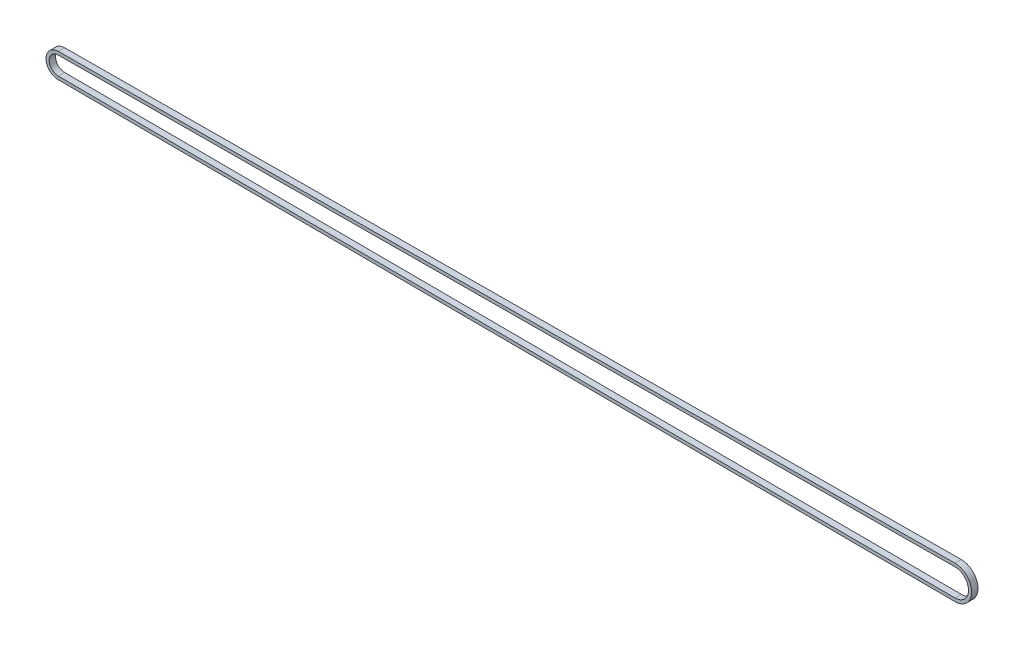
ISO-10303-21;
HEADER;
FILE_DESCRIPTION(('STEP AP214'),'2;1');
FILE_NAME('part.step','',(''),(''),'','','');
FILE_SCHEMA(('AUTOMOTIVE_DESIGN { 1 0 10303 214 1 1 1 1 }'));
ENDSEC;
DATA;
#1=APPLICATION_CONTEXT('core data for automotive mechanical design processes');
#2=APPLICATION_PROTOCOL_DEFINITION('international standard','automotive_design',2000,#1);
#3=PRODUCT_CONTEXT('',#1,'mechanical');
#4=PRODUCT('Part','Part','',(#3));
#5=PRODUCT_RELATED_PRODUCT_CATEGORY('part','',(#4));
#6=PRODUCT_DEFINITION_FORMATION('','',#4);
#7=PRODUCT_DEFINITION_CONTEXT('part definition',#1,'design');
#8=PRODUCT_DEFINITION('design','',#6,#7);
#9=PRODUCT_DEFINITION_SHAPE('','',#8);
#10=(LENGTH_UNIT() NAMED_UNIT(*) SI_UNIT(.MILLI.,.METRE.));
#11=(NAMED_UNIT(*) PLANE_ANGLE_UNIT() SI_UNIT($,.RADIAN.));
#12=(NAMED_UNIT(*) SI_UNIT($,.STERADIAN.) SOLID_ANGLE_UNIT());
#13=UNCERTAINTY_MEASURE_WITH_UNIT(LENGTH_MEASURE(1.E-05),#10,'distance_accuracy_value','');
#14=(GEOMETRIC_REPRESENTATION_CONTEXT(3) GLOBAL_UNCERTAINTY_ASSIGNED_CONTEXT((#13)) GLOBAL_UNIT_ASSIGNED_CONTEXT((#10,
#11,#12)) REPRESENTATION_CONTEXT('',''));
#15=CARTESIAN_POINT('',(0.,0.,0.));
#16=DIRECTION('',(0.,0.,1.));
#17=DIRECTION('',(1.,0.,0.));
#18=AXIS2_PLACEMENT_3D('',#15,#16,#17);
#19=CARTESIAN_POINT('',(-550.781947160668,-62.6493798332166,4.));
#20=DIRECTION('',(0.,0.,-1.));
#21=DIRECTION('',(-1.,0.,0.));
#22=AXIS2_PLACEMENT_3D('',#19,#20,#21);
#23=CYLINDRICAL_SURFACE('',#22,7.75);
#24=CARTESIAN_POINT('',(-550.781947160668,-62.6493798332166,0.));
#25=DIRECTION('',(0.,0.,-1.));
#26=DIRECTION('',(-1.,0.,0.));
#27=AXIS2_PLACEMENT_3D('',#24,#25,#26);
#28=CIRCLE('',#27,7.75);
#29=CARTESIAN_POINT('',(-550.813007049679,-70.3993175931792,0.));
#30=VERTEX_POINT('',#29);
#31=CARTESIAN_POINT('',(-550.826210376147,-54.8995062363277,0.));
#32=VERTEX_POINT('',#31);
#33=EDGE_CURVE('E157',#30,#32,#28,.T.);
#34=ORIENTED_EDGE('',*,*,#33,.F.);
#35=DIRECTION('',(0.,0.,-1.));
#36=VECTOR('',#35,1.);
#37=CARTESIAN_POINT('',(-550.813007049679,-70.3993175931792,4.));
#38=LINE('',#37,#36);
#39=CARTESIAN_POINT('',(-550.813007049679,-70.3993175931792,4.));
#40=VERTEX_POINT('',#39);
#41=EDGE_CURVE('E12',#40,#30,#38,.T.);
#42=ORIENTED_EDGE('',*,*,#41,.F.);
#43=CARTESIAN_POINT('',(-550.781947160668,-62.6493798332166,4.));
#44=DIRECTION('',(0.,0.,-1.));
#45=DIRECTION('',(-1.,0.,0.));
#46=AXIS2_PLACEMENT_3D('',#43,#44,#45);
#47=CIRCLE('',#46,7.75);
#48=CARTESIAN_POINT('',(-550.826210376147,-54.8995062363277,4.));
#49=VERTEX_POINT('',#48);
#50=EDGE_CURVE('E161',#40,#49,#47,.T.);
#51=ORIENTED_EDGE('',*,*,#50,.T.);
#52=DIRECTION('',(0.,0.,-1.));
#53=VECTOR('',#52,1.);
#54=CARTESIAN_POINT('',(-550.826210376147,-54.8995062363277,4.));
#55=LINE('',#54,#53);
#56=EDGE_CURVE('E62',#49,#32,#55,.T.);
#57=ORIENTED_EDGE('',*,*,#56,.T.);
#58=EDGE_LOOP('',(#34,#42,#51,#57));
#59=FACE_BOUND('',#58,.T.);
#60=ADVANCED_FACE('F59',(#59),#23,.T.);
#61=CARTESIAN_POINT('',(15.0709830488165,-72.6672447004356,4.));
#62=DIRECTION('',(-0.00400772761427868,-0.999991969027437,0.));
#63=DIRECTION('',(0.999991969027437,-0.00400772761427868,0.));
#64=AXIS2_PLACEMENT_3D('',#61,#62,#63);
#65=PLANE('',#64);
#66=DIRECTION('',(-0.999991969027436,0.00400772761427868,0.));
#67=VECTOR('',#66,1.);
#68=CARTESIAN_POINT('',(15.0709830488165,-72.6672447004356,0.));
#69=LINE('',#68,#67);
#70=CARTESIAN_POINT('',(15.0709830488165,-72.6672447004356,0.));
#71=VERTEX_POINT('',#70);
#72=EDGE_CURVE('E165',#71,#30,#69,.T.);
#73=ORIENTED_EDGE('',*,*,#72,.F.);
#74=DIRECTION('',(0.,0.,-1.));
#75=VECTOR('',#74,1.);
#76=CARTESIAN_POINT('',(15.0709830488165,-72.6672447004356,4.));
#77=LINE('',#76,#75);
#78=CARTESIAN_POINT('',(15.0709830488165,-72.6672447004356,4.));
#79=VERTEX_POINT('',#78);
#80=EDGE_CURVE('E67',#79,#71,#77,.T.);
#81=ORIENTED_EDGE('',*,*,#80,.F.);
#82=DIRECTION('',(-0.999991969027436,0.00400772761427868,0.));
#83=VECTOR('',#82,1.);
#84=CARTESIAN_POINT('',(15.0709830488165,-72.6672447004356,4.));
#85=LINE('',#84,#83);
#86=EDGE_CURVE('E171',#79,#40,#85,.T.);
#87=ORIENTED_EDGE('',*,*,#86,.T.);
#88=ORIENTED_EDGE('',*,*,#41,.T.);
#89=EDGE_LOOP('',(#73,#81,#87,#88));
#90=FACE_BOUND('',#89,.T.);
#91=ADVANCED_FACE('F197',(#90),#65,.T.);
#92=CARTESIAN_POINT('',(15.1130641887665,-62.1673290256475,4.));
#93=DIRECTION('',(0.,0.,-1.));
#94=DIRECTION('',(-1.,0.,0.));
#95=AXIS2_PLACEMENT_3D('',#92,#93,#94);
#96=CYLINDRICAL_SURFACE('',#95,10.5);
#97=CARTESIAN_POINT('',(15.1130641887665,-62.1673290256475,0.));
#98=DIRECTION('',(0.,0.,-1.));
#99=DIRECTION('',(-1.,0.,0.));
#100=AXIS2_PLACEMENT_3D('',#97,#98,#99);
#101=CIRCLE('',#100,10.5);
#102=CARTESIAN_POINT('',(15.0530946710205,-51.6675002814754,0.));
#103=VERTEX_POINT('',#102);
#104=EDGE_CURVE('E179',#103,#71,#101,.T.);
#105=ORIENTED_EDGE('',*,*,#104,.F.);
#106=DIRECTION('',(0.,0.,-1.));
#107=VECTOR('',#106,1.);
#108=CARTESIAN_POINT('',(15.0530946710205,-51.6675002814754,4.));
#109=LINE('',#108,#107);
#110=CARTESIAN_POINT('',(15.0530946710205,-51.6675002814754,4.));
#111=VERTEX_POINT('',#110);
#112=EDGE_CURVE('E184',#111,#103,#109,.T.);
#113=ORIENTED_EDGE('',*,*,#112,.F.);
#114=CARTESIAN_POINT('',(15.1130641887665,-62.1673290256475,4.));
#115=DIRECTION('',(0.,0.,-1.));
#116=DIRECTION('',(-1.,0.,0.));
#117=AXIS2_PLACEMENT_3D('',#114,#115,#116);
#118=CIRCLE('',#117,10.5);
#119=EDGE_CURVE('E168',#111,#79,#118,.T.);
#120=ORIENTED_EDGE('',*,*,#119,.T.);
#121=ORIENTED_EDGE('',*,*,#80,.T.);
#122=EDGE_LOOP('',(#105,#113,#120,#121));
#123=FACE_BOUND('',#122,.T.);
#124=ADVANCED_FACE('F201',(#123),#96,.T.);
#125=CARTESIAN_POINT('',(-550.826210376147,-54.8995062363277,4.));
#126=DIRECTION('',(-0.00571138264247165,0.999983689921146,0.));
#127=DIRECTION('',(-0.999983689921146,-0.00571138264247165,0.));
#128=AXIS2_PLACEMENT_3D('',#125,#126,#127);
#129=PLANE('',#128);
#130=DIRECTION('',(0.999983689921146,0.00571138264247164,0.));
#131=VECTOR('',#130,1.);
#132=CARTESIAN_POINT('',(-550.826210376147,-54.8995062363277,0.));
#133=LINE('',#132,#131);
#134=EDGE_CURVE('E176',#32,#103,#133,.T.);
#135=ORIENTED_EDGE('',*,*,#134,.F.);
#136=ORIENTED_EDGE('',*,*,#56,.F.);
#137=DIRECTION('',(0.999983689921146,0.00571138264247164,0.));
#138=VECTOR('',#137,1.);
#139=CARTESIAN_POINT('',(-550.826210376147,-54.8995062363277,4.));
#140=LINE('',#139,#138);
#141=EDGE_CURVE('E164',#49,#111,#140,.T.);
#142=ORIENTED_EDGE('',*,*,#141,.T.);
#143=ORIENTED_EDGE('',*,*,#112,.T.);
#144=EDGE_LOOP('',(#135,#136,#142,#143));
#145=FACE_BOUND('',#144,.T.);
#146=ADVANCED_FACE('F192',(#145),#129,.T.);
#147=CARTESIAN_POINT('',(-550.781947160668,-62.6493798332166,4.));
#148=DIRECTION('',(0.,0.,-1.));
#149=DIRECTION('',(-1.,0.,0.));
#150=AXIS2_PLACEMENT_3D('',#147,#148,#149);
#151=PLANE('',#150);
#152=DIRECTION('',(-0.999991969027437,0.00400772761427868,0.));
#153=VECTOR('',#152,1.);
#154=CARTESIAN_POINT('',(-550.80499159445,-68.3993336551244,4.));
#155=LINE('',#154,#153);
#156=CARTESIAN_POINT('',(15.0789985040451,-70.6672607623807,4.));
#157=VERTEX_POINT('',#156);
#158=CARTESIAN_POINT('',(-550.80499159445,-68.3993336551244,4.));
#159=VERTEX_POINT('',#158);
#160=EDGE_CURVE('E132',#157,#159,#155,.T.);
#161=ORIENTED_EDGE('',*,*,#160,.T.);
#162=CARTESIAN_POINT('',(-550.781947160668,-62.6493798332166,4.));
#163=DIRECTION('',(0.,0.,-1.));
#164=DIRECTION('',(-1.,0.,0.));
#165=AXIS2_PLACEMENT_3D('',#162,#163,#164);
#166=CIRCLE('',#165,5.75);
#167=CARTESIAN_POINT('',(-550.814787610862,-56.89947361617,4.));
#168=VERTEX_POINT('',#167);
#169=EDGE_CURVE('E126',#159,#168,#166,.T.);
#170=ORIENTED_EDGE('',*,*,#169,.T.);
#171=DIRECTION('',(0.999983689921146,0.00571138264247165,0.));
#172=VECTOR('',#171,1.);
#173=CARTESIAN_POINT('',(-550.814787610862,-56.89947361617,4.));
#174=LINE('',#173,#172);
#175=CARTESIAN_POINT('',(15.0645174363057,-53.6674676613177,4.));
#176=VERTEX_POINT('',#175);
#177=EDGE_CURVE('E135',#168,#176,#174,.T.);
#178=ORIENTED_EDGE('',*,*,#177,.T.);
#179=CARTESIAN_POINT('',(15.1130641887665,-62.1673290256475,4.));
#180=DIRECTION('',(0.,0.,-1.));
#181=DIRECTION('',(-1.,0.,0.));
#182=AXIS2_PLACEMENT_3D('',#179,#180,#181);
#183=CIRCLE('',#182,8.5);
#184=EDGE_CURVE('E75',#176,#157,#183,.T.);
#185=ORIENTED_EDGE('',*,*,#184,.T.);
#186=EDGE_LOOP('',(#161,#170,#178,#185));
#187=FACE_BOUND('',#186,.T.);
#188=ORIENTED_EDGE('',*,*,#50,.F.);
#189=ORIENTED_EDGE('',*,*,#86,.F.);
#190=ORIENTED_EDGE('',*,*,#119,.F.);
#191=ORIENTED_EDGE('',*,*,#141,.F.);
#192=EDGE_LOOP('',(#188,#189,#190,#191));
#193=FACE_BOUND('',#192,.T.);
#194=ADVANCED_FACE('F139',(#187,#193),#151,.F.);
#195=CARTESIAN_POINT('',(-550.781947160668,-62.6493798332166,0.));
#196=DIRECTION('',(0.,0.,-1.));
#197=DIRECTION('',(-1.,0.,0.));
#198=AXIS2_PLACEMENT_3D('',#195,#196,#197);
#199=PLANE('',#198);
#200=CARTESIAN_POINT('',(-550.781947160668,-62.6493798332166,0.));
#201=DIRECTION('',(0.,0.,-1.));
#202=DIRECTION('',(-1.,0.,0.));
#203=AXIS2_PLACEMENT_3D('',#200,#201,#202);
#204=CIRCLE('',#203,5.75);
#205=CARTESIAN_POINT('',(-550.80499159445,-68.3993336551244,0.));
#206=VERTEX_POINT('',#205);
#207=CARTESIAN_POINT('',(-550.814787610862,-56.89947361617,0.));
#208=VERTEX_POINT('',#207);
#209=EDGE_CURVE('E83',#206,#208,#204,.T.);
#210=ORIENTED_EDGE('',*,*,#209,.F.);
#211=DIRECTION('',(-0.999991969027437,0.00400772761427868,0.));
#212=VECTOR('',#211,1.);
#213=CARTESIAN_POINT('',(-550.80499159445,-68.3993336551244,0.));
#214=LINE('',#213,#212);
#215=CARTESIAN_POINT('',(15.0789985040451,-70.6672607623807,0.));
#216=VERTEX_POINT('',#215);
#217=EDGE_CURVE('E142',#216,#206,#214,.T.);
#218=ORIENTED_EDGE('',*,*,#217,.F.);
#219=CARTESIAN_POINT('',(15.1130641887665,-62.1673290256475,0.));
#220=DIRECTION('',(0.,0.,-1.));
#221=DIRECTION('',(-1.,0.,0.));
#222=AXIS2_PLACEMENT_3D('',#219,#220,#221);
#223=CIRCLE('',#222,8.5);
#224=CARTESIAN_POINT('',(15.0645174363055,-53.6674676613177,0.));
#225=VERTEX_POINT('',#224);
#226=EDGE_CURVE('E145',#225,#216,#223,.T.);
#227=ORIENTED_EDGE('',*,*,#226,.F.);
#228=DIRECTION('',(0.999983689921146,0.00571138264247165,0.));
#229=VECTOR('',#228,1.);
#230=CARTESIAN_POINT('',(-550.814787610862,-56.89947361617,0.));
#231=LINE('',#230,#229);
#232=EDGE_CURVE('E151',#208,#225,#231,.T.);
#233=ORIENTED_EDGE('',*,*,#232,.F.);
#234=EDGE_LOOP('',(#210,#218,#227,#233));
#235=FACE_BOUND('',#234,.T.);
#236=ORIENTED_EDGE('',*,*,#33,.T.);
#237=ORIENTED_EDGE('',*,*,#134,.T.);
#238=ORIENTED_EDGE('',*,*,#104,.T.);
#239=ORIENTED_EDGE('',*,*,#72,.T.);
#240=EDGE_LOOP('',(#236,#237,#238,#239));
#241=FACE_BOUND('',#240,.T.);
#242=ADVANCED_FACE('F194',(#235,#241),#199,.T.);
#243=CARTESIAN_POINT('',(-550.781947160668,-62.6493798332166,4.));
#244=DIRECTION('',(0.,0.,-1.));
#245=DIRECTION('',(-1.,0.,0.));
#246=AXIS2_PLACEMENT_3D('',#243,#244,#245);
#247=CYLINDRICAL_SURFACE('',#246,5.75);
#248=ORIENTED_EDGE('',*,*,#209,.T.);
#249=DIRECTION('',(0.,0.,-1.));
#250=VECTOR('',#249,1.);
#251=CARTESIAN_POINT('',(-550.814787610862,-56.89947361617,4.));
#252=LINE('',#251,#250);
#253=EDGE_CURVE('E122',#168,#208,#252,.T.);
#254=ORIENTED_EDGE('',*,*,#253,.F.);
#255=ORIENTED_EDGE('',*,*,#169,.F.);
#256=DIRECTION('',(0.,0.,-1.));
#257=VECTOR('',#256,1.);
#258=CARTESIAN_POINT('',(-550.80499159445,-68.3993336551244,4.));
#259=LINE('',#258,#257);
#260=EDGE_CURVE('E155',#159,#206,#259,.T.);
#261=ORIENTED_EDGE('',*,*,#260,.T.);
#262=EDGE_LOOP('',(#248,#254,#255,#261));
#263=FACE_BOUND('',#262,.T.);
#264=ADVANCED_FACE('F124',(#263),#247,.F.);
#265=CARTESIAN_POINT('',(-550.80499159445,-68.3993336551244,4.));
#266=DIRECTION('',(-0.00400772761427868,-0.999991969027437,0.));
#267=DIRECTION('',(0.999991969027437,-0.00400772761427868,0.));
#268=AXIS2_PLACEMENT_3D('',#265,#266,#267);
#269=PLANE('',#268);
#270=ORIENTED_EDGE('',*,*,#217,.T.);
#271=ORIENTED_EDGE('',*,*,#260,.F.);
#272=ORIENTED_EDGE('',*,*,#160,.F.);
#273=DIRECTION('',(0.,0.,-1.));
#274=VECTOR('',#273,1.);
#275=CARTESIAN_POINT('',(15.0789985040451,-70.6672607623807,4.));
#276=LINE('',#275,#274);
#277=EDGE_CURVE('E158',#157,#216,#276,.T.);
#278=ORIENTED_EDGE('',*,*,#277,.T.);
#279=EDGE_LOOP('',(#270,#271,#272,#278));
#280=FACE_BOUND('',#279,.T.);
#281=ADVANCED_FACE('F252',(#280),#269,.F.);
#282=CARTESIAN_POINT('',(15.1130641887665,-62.1673290256475,4.));
#283=DIRECTION('',(0.,0.,-1.));
#284=DIRECTION('',(-1.,0.,0.));
#285=AXIS2_PLACEMENT_3D('',#282,#283,#284);
#286=CYLINDRICAL_SURFACE('',#285,8.5);
#287=ORIENTED_EDGE('',*,*,#226,.T.);
#288=ORIENTED_EDGE('',*,*,#277,.F.);
#289=ORIENTED_EDGE('',*,*,#184,.F.);
#290=DIRECTION('',(0.,0.,-1.));
#291=VECTOR('',#290,1.);
#292=CARTESIAN_POINT('',(15.0645174363055,-53.6674676613177,4.));
#293=LINE('',#292,#291);
#294=EDGE_CURVE('E131',#176,#225,#293,.T.);
#295=ORIENTED_EDGE('',*,*,#294,.T.);
#296=EDGE_LOOP('',(#287,#288,#289,#295));
#297=FACE_BOUND('',#296,.T.);
#298=ADVANCED_FACE('F261',(#297),#286,.F.);
#299=CARTESIAN_POINT('',(-550.814787610862,-56.89947361617,4.));
#300=DIRECTION('',(-0.00571138264247165,0.999983689921146,0.));
#301=DIRECTION('',(-0.999983689921147,-0.00571138264247165,0.));
#302=AXIS2_PLACEMENT_3D('',#299,#300,#301);
#303=PLANE('',#302);
#304=ORIENTED_EDGE('',*,*,#232,.T.);
#305=ORIENTED_EDGE('',*,*,#294,.F.);
#306=ORIENTED_EDGE('',*,*,#177,.F.);
#307=ORIENTED_EDGE('',*,*,#253,.T.);
#308=EDGE_LOOP('',(#304,#305,#306,#307));
#309=FACE_BOUND('',#308,.T.);
#310=ADVANCED_FACE('F136',(#309),#303,.F.);
#311=CLOSED_SHELL('',(#60,#91,#124,#146,#194,#242,#264,#281,#298,#310));
#312=MANIFOLD_SOLID_BREP('B2',#311);
#313=ADVANCED_BREP_SHAPE_REPRESENTATION('',(#18,#312),#14);
#314=SHAPE_DEFINITION_REPRESENTATION(#9,#313);
ENDSEC;
END-ISO-10303-21;
